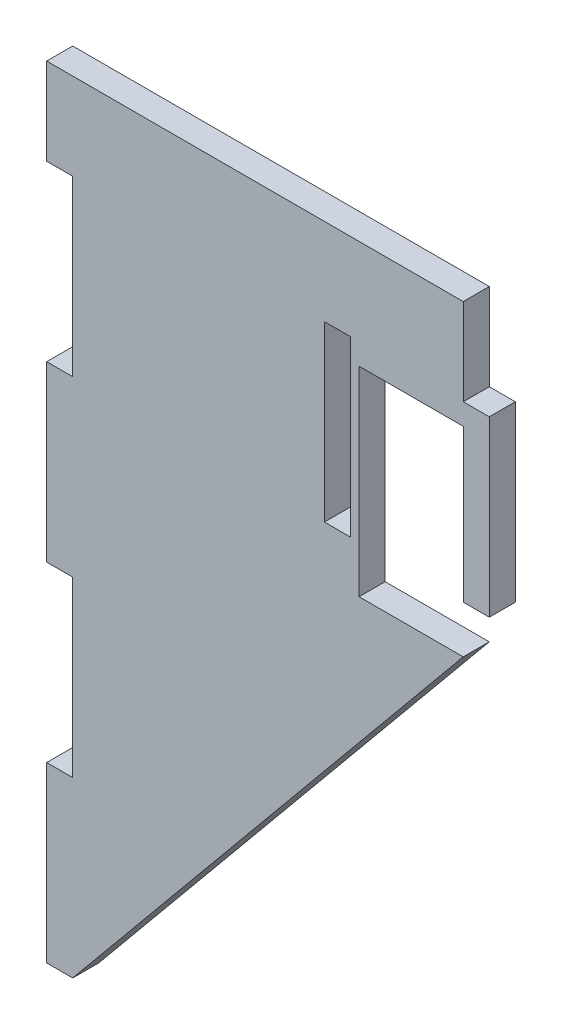
ISO-10303-21;
HEADER;
FILE_DESCRIPTION(('STEP AP214'),'2;1');
FILE_NAME('part.step','',(''),(''),'','','');
FILE_SCHEMA(('AUTOMOTIVE_DESIGN { 1 0 10303 214 1 1 1 1 }'));
ENDSEC;
DATA;
#1=APPLICATION_CONTEXT('core data for automotive mechanical design processes');
#2=APPLICATION_PROTOCOL_DEFINITION('international standard','automotive_design',2000,#1);
#3=PRODUCT_CONTEXT('',#1,'mechanical');
#4=PRODUCT('Part','Part','',(#3));
#5=PRODUCT_RELATED_PRODUCT_CATEGORY('part','',(#4));
#6=PRODUCT_DEFINITION_FORMATION('','',#4);
#7=PRODUCT_DEFINITION_CONTEXT('part definition',#1,'design');
#8=PRODUCT_DEFINITION('design','',#6,#7);
#9=PRODUCT_DEFINITION_SHAPE('','',#8);
#10=(LENGTH_UNIT() NAMED_UNIT(*) SI_UNIT(.MILLI.,.METRE.));
#11=(NAMED_UNIT(*) PLANE_ANGLE_UNIT() SI_UNIT($,.RADIAN.));
#12=(NAMED_UNIT(*) SI_UNIT($,.STERADIAN.) SOLID_ANGLE_UNIT());
#13=UNCERTAINTY_MEASURE_WITH_UNIT(LENGTH_MEASURE(1.E-05),#10,'distance_accuracy_value','');
#14=(GEOMETRIC_REPRESENTATION_CONTEXT(3) GLOBAL_UNCERTAINTY_ASSIGNED_CONTEXT((#13)) GLOBAL_UNIT_ASSIGNED_CONTEXT((#10,
#11,#12)) REPRESENTATION_CONTEXT('',''));
#15=CARTESIAN_POINT('',(0.,0.,0.));
#16=DIRECTION('',(0.,0.,1.));
#17=DIRECTION('',(1.,0.,0.));
#18=AXIS2_PLACEMENT_3D('',#15,#16,#17);
#19=CARTESIAN_POINT('',(0.,0.,3.));
#20=DIRECTION('',(0.,0.,-1.));
#21=DIRECTION('',(-1.,0.,0.));
#22=AXIS2_PLACEMENT_3D('',#19,#20,#21);
#23=PLANE('',#22);
#24=DIRECTION('',(1.,0.,0.));
#25=VECTOR('',#24,1.);
#26=CARTESIAN_POINT('',(-3.00000000000001,40.,3.));
#27=LINE('',#26,#25);
#28=CARTESIAN_POINT('',(-3.00000000000001,40.,3.));
#29=VERTEX_POINT('',#28);
#30=CARTESIAN_POINT('',(0.,40.,3.));
#31=VERTEX_POINT('',#30);
#32=EDGE_CURVE('E232',#29,#31,#27,.T.);
#33=ORIENTED_EDGE('',*,*,#32,.T.);
#34=DIRECTION('',(0.,-1.,0.));
#35=VECTOR('',#34,1.);
#36=CARTESIAN_POINT('',(0.,40.,3.));
#37=LINE('',#36,#35);
#38=CARTESIAN_POINT('',(0.,20.,3.));
#39=VERTEX_POINT('',#38);
#40=EDGE_CURVE('E235',#31,#39,#37,.T.);
#41=ORIENTED_EDGE('',*,*,#40,.T.);
#42=DIRECTION('',(-1.,0.,0.));
#43=VECTOR('',#42,1.);
#44=CARTESIAN_POINT('',(0.,20.,3.));
#45=LINE('',#44,#43);
#46=CARTESIAN_POINT('',(-3.,20.,3.));
#47=VERTEX_POINT('',#46);
#48=EDGE_CURVE('E238',#39,#47,#45,.T.);
#49=ORIENTED_EDGE('',*,*,#48,.T.);
#50=DIRECTION('',(0.,-1.,0.));
#51=VECTOR('',#50,1.);
#52=CARTESIAN_POINT('',(-3.,20.,3.));
#53=LINE('',#52,#51);
#54=CARTESIAN_POINT('',(-3.,0.,3.));
#55=VERTEX_POINT('',#54);
#56=EDGE_CURVE('E240',#47,#55,#53,.T.);
#57=ORIENTED_EDGE('',*,*,#56,.T.);
#58=DIRECTION('',(1.,0.,0.));
#59=VECTOR('',#58,1.);
#60=CARTESIAN_POINT('',(-3.,0.,3.));
#61=LINE('',#60,#59);
#62=CARTESIAN_POINT('',(0.,0.,3.));
#63=VERTEX_POINT('',#62);
#64=EDGE_CURVE('E242',#55,#63,#61,.T.);
#65=ORIENTED_EDGE('',*,*,#64,.T.);
#66=DIRECTION('',(0.636382954795564,0.771373278540077,0.));
#67=VECTOR('',#66,1.);
#68=CARTESIAN_POINT('',(0.,0.,3.));
#69=LINE('',#68,#67);
#70=CARTESIAN_POINT('',(45.,54.5454545454545,3.));
#71=VERTEX_POINT('',#70);
#72=EDGE_CURVE('E244',#63,#71,#69,.T.);
#73=ORIENTED_EDGE('',*,*,#72,.T.);
#74=DIRECTION('',(-1.,0.,0.));
#75=VECTOR('',#74,1.);
#76=CARTESIAN_POINT('',(45.,54.5454545454545,3.));
#77=LINE('',#76,#75);
#78=CARTESIAN_POINT('',(33.,54.5454545454545,3.));
#79=VERTEX_POINT('',#78);
#80=EDGE_CURVE('E246',#71,#79,#77,.T.);
#81=ORIENTED_EDGE('',*,*,#80,.T.);
#82=DIRECTION('',(0.,1.,0.));
#83=VECTOR('',#82,1.);
#84=CARTESIAN_POINT('',(33.,54.5454545454545,3.));
#85=LINE('',#84,#83);
#86=CARTESIAN_POINT('',(33.,77.5454545454545,3.));
#87=VERTEX_POINT('',#86);
#88=EDGE_CURVE('E248',#79,#87,#85,.T.);
#89=ORIENTED_EDGE('',*,*,#88,.T.);
#90=DIRECTION('',(1.,0.,0.));
#91=VECTOR('',#90,1.);
#92=CARTESIAN_POINT('',(33.,77.5454545454545,3.));
#93=LINE('',#92,#91);
#94=CARTESIAN_POINT('',(45.,77.5454545454545,3.));
#95=VERTEX_POINT('',#94);
#96=EDGE_CURVE('E250',#87,#95,#93,.T.);
#97=ORIENTED_EDGE('',*,*,#96,.T.);
#98=DIRECTION('',(0.,-1.,0.));
#99=VECTOR('',#98,1.);
#100=CARTESIAN_POINT('',(45.,77.5454545454545,3.));
#101=LINE('',#100,#99);
#102=CARTESIAN_POINT('',(45.,60.,3.));
#103=VERTEX_POINT('',#102);
#104=EDGE_CURVE('E252',#95,#103,#101,.T.);
#105=ORIENTED_EDGE('',*,*,#104,.T.);
#106=DIRECTION('',(1.,0.,0.));
#107=VECTOR('',#106,1.);
#108=CARTESIAN_POINT('',(48.,60.,3.));
#109=LINE('',#108,#107);
#110=CARTESIAN_POINT('',(48.,60.,3.));
#111=VERTEX_POINT('',#110);
#112=EDGE_CURVE('E254',#103,#111,#109,.T.);
#113=ORIENTED_EDGE('',*,*,#112,.T.);
#114=DIRECTION('',(0.,1.,0.));
#115=VECTOR('',#114,1.);
#116=CARTESIAN_POINT('',(48.,80.,3.));
#117=LINE('',#116,#115);
#118=CARTESIAN_POINT('',(48.,80.,3.));
#119=VERTEX_POINT('',#118);
#120=EDGE_CURVE('E256',#111,#119,#117,.T.);
#121=ORIENTED_EDGE('',*,*,#120,.T.);
#122=DIRECTION('',(-1.,0.,0.));
#123=VECTOR('',#122,1.);
#124=CARTESIAN_POINT('',(45.,80.,3.));
#125=LINE('',#124,#123);
#126=CARTESIAN_POINT('',(45.,80.,3.));
#127=VERTEX_POINT('',#126);
#128=EDGE_CURVE('E258',#119,#127,#125,.T.);
#129=ORIENTED_EDGE('',*,*,#128,.T.);
#130=DIRECTION('',(0.,1.,0.));
#131=VECTOR('',#130,1.);
#132=CARTESIAN_POINT('',(45.,90.,3.));
#133=LINE('',#132,#131);
#134=CARTESIAN_POINT('',(45.,90.,3.));
#135=VERTEX_POINT('',#134);
#136=EDGE_CURVE('E260',#127,#135,#133,.T.);
#137=ORIENTED_EDGE('',*,*,#136,.T.);
#138=DIRECTION('',(-1.,0.,0.));
#139=VECTOR('',#138,1.);
#140=CARTESIAN_POINT('',(15.,90.,3.));
#141=LINE('',#140,#139);
#142=CARTESIAN_POINT('',(-3.00000000000001,90.,3.));
#143=VERTEX_POINT('',#142);
#144=EDGE_CURVE('E262',#135,#143,#141,.T.);
#145=ORIENTED_EDGE('',*,*,#144,.T.);
#146=DIRECTION('',(0.,-1.,0.));
#147=VECTOR('',#146,1.);
#148=CARTESIAN_POINT('',(-3.,80.,3.));
#149=LINE('',#148,#147);
#150=CARTESIAN_POINT('',(-3.,80.,3.));
#151=VERTEX_POINT('',#150);
#152=EDGE_CURVE('E264',#143,#151,#149,.T.);
#153=ORIENTED_EDGE('',*,*,#152,.T.);
#154=DIRECTION('',(1.,0.,0.));
#155=VECTOR('',#154,1.);
#156=CARTESIAN_POINT('',(0.,80.,3.));
#157=LINE('',#156,#155);
#158=CARTESIAN_POINT('',(0.,80.,3.));
#159=VERTEX_POINT('',#158);
#160=EDGE_CURVE('E266',#151,#159,#157,.T.);
#161=ORIENTED_EDGE('',*,*,#160,.T.);
#162=DIRECTION('',(0.,-1.,0.));
#163=VECTOR('',#162,1.);
#164=CARTESIAN_POINT('',(0.,60.,3.));
#165=LINE('',#164,#163);
#166=CARTESIAN_POINT('',(0.,60.,3.));
#167=VERTEX_POINT('',#166);
#168=EDGE_CURVE('E268',#159,#167,#165,.T.);
#169=ORIENTED_EDGE('',*,*,#168,.T.);
#170=DIRECTION('',(-1.,0.,0.));
#171=VECTOR('',#170,1.);
#172=CARTESIAN_POINT('',(-3.00000000000001,60.,3.));
#173=LINE('',#172,#171);
#174=CARTESIAN_POINT('',(-3.00000000000001,60.,3.));
#175=VERTEX_POINT('',#174);
#176=EDGE_CURVE('E270',#167,#175,#173,.T.);
#177=ORIENTED_EDGE('',*,*,#176,.T.);
#178=DIRECTION('',(0.,-1.,0.));
#179=VECTOR('',#178,1.);
#180=CARTESIAN_POINT('',(-3.00000000000001,60.,3.));
#181=LINE('',#180,#179);
#182=EDGE_CURVE('E272',#175,#29,#181,.T.);
#183=ORIENTED_EDGE('',*,*,#182,.T.);
#184=EDGE_LOOP('',(#33,#41,#49,#57,#65,#73,#81,#89,#97,#105,#113,#121,#129,#137,#145,#153,#161,
#169,#177,#183));
#185=FACE_BOUND('',#184,.T.);
#186=DIRECTION('',(0.,1.,0.));
#187=VECTOR('',#186,1.);
#188=CARTESIAN_POINT('',(32.,60.,3.));
#189=LINE('',#188,#187);
#190=CARTESIAN_POINT('',(32.,60.,3.));
#191=VERTEX_POINT('',#190);
#192=CARTESIAN_POINT('',(32.,80.,3.));
#193=VERTEX_POINT('',#192);
#194=EDGE_CURVE('E196',#191,#193,#189,.T.);
#195=ORIENTED_EDGE('',*,*,#194,.F.);
#196=DIRECTION('',(1.,0.,0.));
#197=VECTOR('',#196,1.);
#198=CARTESIAN_POINT('',(32.,60.,3.));
#199=LINE('',#198,#197);
#200=CARTESIAN_POINT('',(29.,60.,3.));
#201=VERTEX_POINT('',#200);
#202=EDGE_CURVE('E218',#201,#191,#199,.T.);
#203=ORIENTED_EDGE('',*,*,#202,.F.);
#204=DIRECTION('',(0.,-1.,0.));
#205=VECTOR('',#204,1.);
#206=CARTESIAN_POINT('',(29.,60.,3.));
#207=LINE('',#206,#205);
#208=CARTESIAN_POINT('',(29.,80.,3.));
#209=VERTEX_POINT('',#208);
#210=EDGE_CURVE('E216',#209,#201,#207,.T.);
#211=ORIENTED_EDGE('',*,*,#210,.F.);
#212=DIRECTION('',(-1.,0.,0.));
#213=VECTOR('',#212,1.);
#214=CARTESIAN_POINT('',(29.,80.,3.));
#215=LINE('',#214,#213);
#216=EDGE_CURVE('E204',#193,#209,#215,.T.);
#217=ORIENTED_EDGE('',*,*,#216,.F.);
#218=EDGE_LOOP('',(#195,#203,#211,#217));
#219=FACE_BOUND('',#218,.T.);
#220=ADVANCED_FACE('F35',(#185,#219),#23,.F.);
#221=CARTESIAN_POINT('',(0.,0.,0.));
#222=DIRECTION('',(0.,0.,-1.));
#223=DIRECTION('',(-1.,0.,0.));
#224=AXIS2_PLACEMENT_3D('',#221,#222,#223);
#225=PLANE('',#224);
#226=DIRECTION('',(1.,0.,0.));
#227=VECTOR('',#226,1.);
#228=CARTESIAN_POINT('',(-3.00000000000001,40.,0.));
#229=LINE('',#228,#227);
#230=CARTESIAN_POINT('',(-3.00000000000001,40.,0.));
#231=VERTEX_POINT('',#230);
#232=CARTESIAN_POINT('',(0.,40.,0.));
#233=VERTEX_POINT('',#232);
#234=EDGE_CURVE('E212',#231,#233,#229,.T.);
#235=ORIENTED_EDGE('',*,*,#234,.F.);
#236=DIRECTION('',(0.,-1.,0.));
#237=VECTOR('',#236,1.);
#238=CARTESIAN_POINT('',(-3.00000000000001,60.,0.));
#239=LINE('',#238,#237);
#240=CARTESIAN_POINT('',(-3.00000000000001,60.,0.));
#241=VERTEX_POINT('',#240);
#242=EDGE_CURVE('E236',#241,#231,#239,.T.);
#243=ORIENTED_EDGE('',*,*,#242,.F.);
#244=DIRECTION('',(-1.,0.,0.));
#245=VECTOR('',#244,1.);
#246=CARTESIAN_POINT('',(-3.00000000000001,60.,0.));
#247=LINE('',#246,#245);
#248=CARTESIAN_POINT('',(0.,60.,0.));
#249=VERTEX_POINT('',#248);
#250=EDGE_CURVE('E312',#249,#241,#247,.T.);
#251=ORIENTED_EDGE('',*,*,#250,.F.);
#252=DIRECTION('',(0.,-1.,0.));
#253=VECTOR('',#252,1.);
#254=CARTESIAN_POINT('',(0.,60.,0.));
#255=LINE('',#254,#253);
#256=CARTESIAN_POINT('',(0.,80.,0.));
#257=VERTEX_POINT('',#256);
#258=EDGE_CURVE('E310',#257,#249,#255,.T.);
#259=ORIENTED_EDGE('',*,*,#258,.F.);
#260=DIRECTION('',(1.,0.,0.));
#261=VECTOR('',#260,1.);
#262=CARTESIAN_POINT('',(0.,80.,0.));
#263=LINE('',#262,#261);
#264=CARTESIAN_POINT('',(-3.,80.,0.));
#265=VERTEX_POINT('',#264);
#266=EDGE_CURVE('E308',#265,#257,#263,.T.);
#267=ORIENTED_EDGE('',*,*,#266,.F.);
#268=DIRECTION('',(0.,-1.,0.));
#269=VECTOR('',#268,1.);
#270=CARTESIAN_POINT('',(-3.,80.,0.));
#271=LINE('',#270,#269);
#272=CARTESIAN_POINT('',(-3.00000000000001,90.,0.));
#273=VERTEX_POINT('',#272);
#274=EDGE_CURVE('E306',#273,#265,#271,.T.);
#275=ORIENTED_EDGE('',*,*,#274,.F.);
#276=DIRECTION('',(-1.,0.,0.));
#277=VECTOR('',#276,1.);
#278=CARTESIAN_POINT('',(-3.00000000000001,90.,0.));
#279=LINE('',#278,#277);
#280=CARTESIAN_POINT('',(45.,90.,0.));
#281=VERTEX_POINT('',#280);
#282=EDGE_CURVE('E304',#281,#273,#279,.T.);
#283=ORIENTED_EDGE('',*,*,#282,.F.);
#284=DIRECTION('',(0.,1.,0.));
#285=VECTOR('',#284,1.);
#286=CARTESIAN_POINT('',(45.,90.,0.));
#287=LINE('',#286,#285);
#288=CARTESIAN_POINT('',(45.,80.,0.));
#289=VERTEX_POINT('',#288);
#290=EDGE_CURVE('E301',#289,#281,#287,.T.);
#291=ORIENTED_EDGE('',*,*,#290,.F.);
#292=DIRECTION('',(-1.,0.,0.));
#293=VECTOR('',#292,1.);
#294=CARTESIAN_POINT('',(45.,80.,0.));
#295=LINE('',#294,#293);
#296=CARTESIAN_POINT('',(48.,80.,0.));
#297=VERTEX_POINT('',#296);
#298=EDGE_CURVE('E299',#297,#289,#295,.T.);
#299=ORIENTED_EDGE('',*,*,#298,.F.);
#300=DIRECTION('',(0.,1.,0.));
#301=VECTOR('',#300,1.);
#302=CARTESIAN_POINT('',(48.,80.,0.));
#303=LINE('',#302,#301);
#304=CARTESIAN_POINT('',(48.,60.,0.));
#305=VERTEX_POINT('',#304);
#306=EDGE_CURVE('E297',#305,#297,#303,.T.);
#307=ORIENTED_EDGE('',*,*,#306,.F.);
#308=DIRECTION('',(1.,0.,0.));
#309=VECTOR('',#308,1.);
#310=CARTESIAN_POINT('',(48.,60.,0.));
#311=LINE('',#310,#309);
#312=CARTESIAN_POINT('',(45.,60.,0.));
#313=VERTEX_POINT('',#312);
#314=EDGE_CURVE('E295',#313,#305,#311,.T.);
#315=ORIENTED_EDGE('',*,*,#314,.F.);
#316=DIRECTION('',(0.,-1.,0.));
#317=VECTOR('',#316,1.);
#318=CARTESIAN_POINT('',(45.,77.5454545454545,0.));
#319=LINE('',#318,#317);
#320=CARTESIAN_POINT('',(45.,77.5454545454545,0.));
#321=VERTEX_POINT('',#320);
#322=EDGE_CURVE('E293',#321,#313,#319,.T.);
#323=ORIENTED_EDGE('',*,*,#322,.F.);
#324=DIRECTION('',(1.,0.,0.));
#325=VECTOR('',#324,1.);
#326=CARTESIAN_POINT('',(33.,77.5454545454545,0.));
#327=LINE('',#326,#325);
#328=CARTESIAN_POINT('',(33.,77.5454545454545,0.));
#329=VERTEX_POINT('',#328);
#330=EDGE_CURVE('E291',#329,#321,#327,.T.);
#331=ORIENTED_EDGE('',*,*,#330,.F.);
#332=DIRECTION('',(0.,1.,0.));
#333=VECTOR('',#332,1.);
#334=CARTESIAN_POINT('',(33.,54.5454545454545,0.));
#335=LINE('',#334,#333);
#336=CARTESIAN_POINT('',(33.,54.5454545454545,0.));
#337=VERTEX_POINT('',#336);
#338=EDGE_CURVE('E289',#337,#329,#335,.T.);
#339=ORIENTED_EDGE('',*,*,#338,.F.);
#340=DIRECTION('',(-1.,0.,0.));
#341=VECTOR('',#340,1.);
#342=CARTESIAN_POINT('',(45.,54.5454545454545,0.));
#343=LINE('',#342,#341);
#344=CARTESIAN_POINT('',(45.,54.5454545454545,0.));
#345=VERTEX_POINT('',#344);
#346=EDGE_CURVE('E287',#345,#337,#343,.T.);
#347=ORIENTED_EDGE('',*,*,#346,.F.);
#348=DIRECTION('',(0.636382954795564,0.771373278540077,0.));
#349=VECTOR('',#348,1.);
#350=CARTESIAN_POINT('',(0.,0.,0.));
#351=LINE('',#350,#349);
#352=CARTESIAN_POINT('',(0.,0.,0.));
#353=VERTEX_POINT('',#352);
#354=EDGE_CURVE('E285',#353,#345,#351,.T.);
#355=ORIENTED_EDGE('',*,*,#354,.F.);
#356=DIRECTION('',(1.,0.,0.));
#357=VECTOR('',#356,1.);
#358=CARTESIAN_POINT('',(-3.,0.,0.));
#359=LINE('',#358,#357);
#360=CARTESIAN_POINT('',(-3.,0.,0.));
#361=VERTEX_POINT('',#360);
#362=EDGE_CURVE('E283',#361,#353,#359,.T.);
#363=ORIENTED_EDGE('',*,*,#362,.F.);
#364=DIRECTION('',(0.,-1.,0.));
#365=VECTOR('',#364,1.);
#366=CARTESIAN_POINT('',(-3.,20.,0.));
#367=LINE('',#366,#365);
#368=CARTESIAN_POINT('',(-3.,20.,0.));
#369=VERTEX_POINT('',#368);
#370=EDGE_CURVE('E281',#369,#361,#367,.T.);
#371=ORIENTED_EDGE('',*,*,#370,.F.);
#372=DIRECTION('',(-1.,0.,0.));
#373=VECTOR('',#372,1.);
#374=CARTESIAN_POINT('',(0.,20.,0.));
#375=LINE('',#374,#373);
#376=CARTESIAN_POINT('',(0.,20.,0.));
#377=VERTEX_POINT('',#376);
#378=EDGE_CURVE('E279',#377,#369,#375,.T.);
#379=ORIENTED_EDGE('',*,*,#378,.F.);
#380=DIRECTION('',(0.,-1.,0.));
#381=VECTOR('',#380,1.);
#382=CARTESIAN_POINT('',(0.,40.,0.));
#383=LINE('',#382,#381);
#384=EDGE_CURVE('E277',#233,#377,#383,.T.);
#385=ORIENTED_EDGE('',*,*,#384,.F.);
#386=EDGE_LOOP('',(#235,#243,#251,#259,#267,#275,#283,#291,#299,#307,#315,#323,#331,#339,#347,
#355,#363,#371,#379,#385));
#387=FACE_BOUND('',#386,.T.);
#388=DIRECTION('',(1.,0.,0.));
#389=VECTOR('',#388,1.);
#390=CARTESIAN_POINT('',(32.,60.,0.));
#391=LINE('',#390,#389);
#392=CARTESIAN_POINT('',(29.,60.,0.));
#393=VERTEX_POINT('',#392);
#394=CARTESIAN_POINT('',(32.,60.,0.));
#395=VERTEX_POINT('',#394);
#396=EDGE_CURVE('E205',#393,#395,#391,.T.);
#397=ORIENTED_EDGE('',*,*,#396,.T.);
#398=DIRECTION('',(0.,1.,0.));
#399=VECTOR('',#398,1.);
#400=CARTESIAN_POINT('',(32.,60.,0.));
#401=LINE('',#400,#399);
#402=CARTESIAN_POINT('',(32.,80.,0.));
#403=VERTEX_POINT('',#402);
#404=EDGE_CURVE('E58',#395,#403,#401,.T.);
#405=ORIENTED_EDGE('',*,*,#404,.T.);
#406=DIRECTION('',(-1.,0.,0.));
#407=VECTOR('',#406,1.);
#408=CARTESIAN_POINT('',(29.,80.,0.));
#409=LINE('',#408,#407);
#410=CARTESIAN_POINT('',(29.,80.,0.));
#411=VERTEX_POINT('',#410);
#412=EDGE_CURVE('E211',#403,#411,#409,.T.);
#413=ORIENTED_EDGE('',*,*,#412,.T.);
#414=DIRECTION('',(0.,-1.,0.));
#415=VECTOR('',#414,1.);
#416=CARTESIAN_POINT('',(29.,60.,0.));
#417=LINE('',#416,#415);
#418=EDGE_CURVE('E224',#411,#393,#417,.T.);
#419=ORIENTED_EDGE('',*,*,#418,.T.);
#420=EDGE_LOOP('',(#397,#405,#413,#419));
#421=FACE_BOUND('',#420,.T.);
#422=ADVANCED_FACE('F378',(#387,#421),#225,.T.);
#423=CARTESIAN_POINT('',(-3.00000000000001,40.,3.));
#424=DIRECTION('',(0.,1.,0.));
#425=DIRECTION('',(0.,0.,1.));
#426=AXIS2_PLACEMENT_3D('',#423,#424,#425);
#427=PLANE('',#426);
#428=ORIENTED_EDGE('',*,*,#234,.T.);
#429=DIRECTION('',(0.,0.,-1.));
#430=VECTOR('',#429,1.);
#431=CARTESIAN_POINT('',(0.,40.,3.));
#432=LINE('',#431,#430);
#433=EDGE_CURVE('E11',#31,#233,#432,.T.);
#434=ORIENTED_EDGE('',*,*,#433,.F.);
#435=ORIENTED_EDGE('',*,*,#32,.F.);
#436=DIRECTION('',(0.,0.,-1.));
#437=VECTOR('',#436,1.);
#438=CARTESIAN_POINT('',(-3.00000000000001,40.,3.));
#439=LINE('',#438,#437);
#440=EDGE_CURVE('E274',#29,#231,#439,.T.);
#441=ORIENTED_EDGE('',*,*,#440,.T.);
#442=EDGE_LOOP('',(#428,#434,#435,#441));
#443=FACE_BOUND('',#442,.T.);
#444=ADVANCED_FACE('F37',(#443),#427,.F.);
#445=CARTESIAN_POINT('',(0.,40.,3.));
#446=DIRECTION('',(1.,0.,0.));
#447=DIRECTION('',(0.,0.,-1.));
#448=AXIS2_PLACEMENT_3D('',#445,#446,#447);
#449=PLANE('',#448);
#450=ORIENTED_EDGE('',*,*,#384,.T.);
#451=DIRECTION('',(0.,0.,-1.));
#452=VECTOR('',#451,1.);
#453=CARTESIAN_POINT('',(0.,20.,3.));
#454=LINE('',#453,#452);
#455=EDGE_CURVE('E43',#39,#377,#454,.T.);
#456=ORIENTED_EDGE('',*,*,#455,.F.);
#457=ORIENTED_EDGE('',*,*,#40,.F.);
#458=ORIENTED_EDGE('',*,*,#433,.T.);
#459=EDGE_LOOP('',(#450,#456,#457,#458));
#460=FACE_BOUND('',#459,.T.);
#461=ADVANCED_FACE('F395',(#460),#449,.F.);
#462=CARTESIAN_POINT('',(0.,20.,3.));
#463=DIRECTION('',(0.,-1.,0.));
#464=DIRECTION('',(1.,0.,0.));
#465=AXIS2_PLACEMENT_3D('',#462,#463,#464);
#466=PLANE('',#465);
#467=ORIENTED_EDGE('',*,*,#378,.T.);
#468=DIRECTION('',(0.,0.,-1.));
#469=VECTOR('',#468,1.);
#470=CARTESIAN_POINT('',(-3.,20.,3.));
#471=LINE('',#470,#469);
#472=EDGE_CURVE('E365',#47,#369,#471,.T.);
#473=ORIENTED_EDGE('',*,*,#472,.F.);
#474=ORIENTED_EDGE('',*,*,#48,.F.);
#475=ORIENTED_EDGE('',*,*,#455,.T.);
#476=EDGE_LOOP('',(#467,#473,#474,#475));
#477=FACE_BOUND('',#476,.T.);
#478=ADVANCED_FACE('F372',(#477),#466,.F.);
#479=CARTESIAN_POINT('',(-3.,20.,3.));
#480=DIRECTION('',(1.,0.,0.));
#481=DIRECTION('',(0.,1.,0.));
#482=AXIS2_PLACEMENT_3D('',#479,#480,#481);
#483=PLANE('',#482);
#484=ORIENTED_EDGE('',*,*,#370,.T.);
#485=DIRECTION('',(0.,0.,-1.));
#486=VECTOR('',#485,1.);
#487=CARTESIAN_POINT('',(-3.,0.,3.));
#488=LINE('',#487,#486);
#489=EDGE_CURVE('E362',#55,#361,#488,.T.);
#490=ORIENTED_EDGE('',*,*,#489,.F.);
#491=ORIENTED_EDGE('',*,*,#56,.F.);
#492=ORIENTED_EDGE('',*,*,#472,.T.);
#493=EDGE_LOOP('',(#484,#490,#491,#492));
#494=FACE_BOUND('',#493,.T.);
#495=ADVANCED_FACE('F384',(#494),#483,.F.);
#496=CARTESIAN_POINT('',(-3.,0.,3.));
#497=DIRECTION('',(0.,1.,0.));
#498=DIRECTION('',(0.,0.,1.));
#499=AXIS2_PLACEMENT_3D('',#496,#497,#498);
#500=PLANE('',#499);
#501=ORIENTED_EDGE('',*,*,#362,.T.);
#502=DIRECTION('',(0.,0.,-1.));
#503=VECTOR('',#502,1.);
#504=CARTESIAN_POINT('',(0.,0.,3.));
#505=LINE('',#504,#503);
#506=EDGE_CURVE('E359',#63,#353,#505,.T.);
#507=ORIENTED_EDGE('',*,*,#506,.F.);
#508=ORIENTED_EDGE('',*,*,#64,.F.);
#509=ORIENTED_EDGE('',*,*,#489,.T.);
#510=EDGE_LOOP('',(#501,#507,#508,#509));
#511=FACE_BOUND('',#510,.T.);
#512=ADVANCED_FACE('F388',(#511),#500,.F.);
#513=CARTESIAN_POINT('',(0.,0.,3.));
#514=DIRECTION('',(-0.771373278540077,0.636382954795564,0.));
#515=DIRECTION('',(-0.636382954795564,-0.771373278540077,0.));
#516=AXIS2_PLACEMENT_3D('',#513,#514,#515);
#517=PLANE('',#516);
#518=ORIENTED_EDGE('',*,*,#354,.T.);
#519=DIRECTION('',(0.,0.,-1.));
#520=VECTOR('',#519,1.);
#521=CARTESIAN_POINT('',(45.,54.5454545454545,3.));
#522=LINE('',#521,#520);
#523=EDGE_CURVE('E356',#71,#345,#522,.T.);
#524=ORIENTED_EDGE('',*,*,#523,.F.);
#525=ORIENTED_EDGE('',*,*,#72,.F.);
#526=ORIENTED_EDGE('',*,*,#506,.T.);
#527=EDGE_LOOP('',(#518,#524,#525,#526));
#528=FACE_BOUND('',#527,.T.);
#529=ADVANCED_FACE('F467',(#528),#517,.F.);
#530=CARTESIAN_POINT('',(45.,54.5454545454545,3.));
#531=DIRECTION('',(0.,-1.,0.));
#532=DIRECTION('',(0.,0.,-1.));
#533=AXIS2_PLACEMENT_3D('',#530,#531,#532);
#534=PLANE('',#533);
#535=ORIENTED_EDGE('',*,*,#346,.T.);
#536=DIRECTION('',(0.,0.,-1.));
#537=VECTOR('',#536,1.);
#538=CARTESIAN_POINT('',(33.,54.5454545454545,3.));
#539=LINE('',#538,#537);
#540=EDGE_CURVE('E353',#79,#337,#539,.T.);
#541=ORIENTED_EDGE('',*,*,#540,.F.);
#542=ORIENTED_EDGE('',*,*,#80,.F.);
#543=ORIENTED_EDGE('',*,*,#523,.T.);
#544=EDGE_LOOP('',(#535,#541,#542,#543));
#545=FACE_BOUND('',#544,.T.);
#546=ADVANCED_FACE('F465',(#545),#534,.F.);
#547=CARTESIAN_POINT('',(33.,54.5454545454545,3.));
#548=DIRECTION('',(-1.,0.,0.));
#549=DIRECTION('',(0.,0.,1.));
#550=AXIS2_PLACEMENT_3D('',#547,#548,#549);
#551=PLANE('',#550);
#552=ORIENTED_EDGE('',*,*,#338,.T.);
#553=DIRECTION('',(0.,0.,-1.));
#554=VECTOR('',#553,1.);
#555=CARTESIAN_POINT('',(33.,77.5454545454545,3.));
#556=LINE('',#555,#554);
#557=EDGE_CURVE('E350',#87,#329,#556,.T.);
#558=ORIENTED_EDGE('',*,*,#557,.F.);
#559=ORIENTED_EDGE('',*,*,#88,.F.);
#560=ORIENTED_EDGE('',*,*,#540,.T.);
#561=EDGE_LOOP('',(#552,#558,#559,#560));
#562=FACE_BOUND('',#561,.T.);
#563=ADVANCED_FACE('F461',(#562),#551,.F.);
#564=CARTESIAN_POINT('',(33.,77.5454545454545,3.));
#565=DIRECTION('',(0.,1.,0.));
#566=DIRECTION('',(0.,0.,1.));
#567=AXIS2_PLACEMENT_3D('',#564,#565,#566);
#568=PLANE('',#567);
#569=ORIENTED_EDGE('',*,*,#330,.T.);
#570=DIRECTION('',(0.,0.,-1.));
#571=VECTOR('',#570,1.);
#572=CARTESIAN_POINT('',(45.,77.5454545454545,3.));
#573=LINE('',#572,#571);
#574=EDGE_CURVE('E347',#95,#321,#573,.T.);
#575=ORIENTED_EDGE('',*,*,#574,.F.);
#576=ORIENTED_EDGE('',*,*,#96,.F.);
#577=ORIENTED_EDGE('',*,*,#557,.T.);
#578=EDGE_LOOP('',(#569,#575,#576,#577));
#579=FACE_BOUND('',#578,.T.);
#580=ADVANCED_FACE('F456',(#579),#568,.F.);
#581=CARTESIAN_POINT('',(45.,77.5454545454545,3.));
#582=DIRECTION('',(1.,0.,0.));
#583=DIRECTION('',(0.,1.,0.));
#584=AXIS2_PLACEMENT_3D('',#581,#582,#583);
#585=PLANE('',#584);
#586=ORIENTED_EDGE('',*,*,#322,.T.);
#587=DIRECTION('',(0.,0.,-1.));
#588=VECTOR('',#587,1.);
#589=CARTESIAN_POINT('',(45.,60.,3.));
#590=LINE('',#589,#588);
#591=EDGE_CURVE('E344',#103,#313,#590,.T.);
#592=ORIENTED_EDGE('',*,*,#591,.F.);
#593=ORIENTED_EDGE('',*,*,#104,.F.);
#594=ORIENTED_EDGE('',*,*,#574,.T.);
#595=EDGE_LOOP('',(#586,#592,#593,#594));
#596=FACE_BOUND('',#595,.T.);
#597=ADVANCED_FACE('F450',(#596),#585,.F.);
#598=CARTESIAN_POINT('',(48.,60.,3.));
#599=DIRECTION('',(0.,1.,0.));
#600=DIRECTION('',(0.,0.,1.));
#601=AXIS2_PLACEMENT_3D('',#598,#599,#600);
#602=PLANE('',#601);
#603=ORIENTED_EDGE('',*,*,#314,.T.);
#604=DIRECTION('',(0.,0.,-1.));
#605=VECTOR('',#604,1.);
#606=CARTESIAN_POINT('',(48.,60.,3.));
#607=LINE('',#606,#605);
#608=EDGE_CURVE('E341',#111,#305,#607,.T.);
#609=ORIENTED_EDGE('',*,*,#608,.F.);
#610=ORIENTED_EDGE('',*,*,#112,.F.);
#611=ORIENTED_EDGE('',*,*,#591,.T.);
#612=EDGE_LOOP('',(#603,#609,#610,#611));
#613=FACE_BOUND('',#612,.T.);
#614=ADVANCED_FACE('F446',(#613),#602,.F.);
#615=CARTESIAN_POINT('',(48.,80.,3.));
#616=DIRECTION('',(-1.,0.,0.));
#617=DIRECTION('',(0.,0.,1.));
#618=AXIS2_PLACEMENT_3D('',#615,#616,#617);
#619=PLANE('',#618);
#620=ORIENTED_EDGE('',*,*,#306,.T.);
#621=DIRECTION('',(0.,0.,-1.));
#622=VECTOR('',#621,1.);
#623=CARTESIAN_POINT('',(48.,80.,3.));
#624=LINE('',#623,#622);
#625=EDGE_CURVE('E338',#119,#297,#624,.T.);
#626=ORIENTED_EDGE('',*,*,#625,.F.);
#627=ORIENTED_EDGE('',*,*,#120,.F.);
#628=ORIENTED_EDGE('',*,*,#608,.T.);
#629=EDGE_LOOP('',(#620,#626,#627,#628));
#630=FACE_BOUND('',#629,.T.);
#631=ADVANCED_FACE('F441',(#630),#619,.F.);
#632=CARTESIAN_POINT('',(45.,80.,3.));
#633=DIRECTION('',(0.,-1.,0.));
#634=DIRECTION('',(0.,0.,-1.));
#635=AXIS2_PLACEMENT_3D('',#632,#633,#634);
#636=PLANE('',#635);
#637=ORIENTED_EDGE('',*,*,#298,.T.);
#638=DIRECTION('',(0.,0.,-1.));
#639=VECTOR('',#638,1.);
#640=CARTESIAN_POINT('',(45.,80.,3.));
#641=LINE('',#640,#639);
#642=EDGE_CURVE('E335',#127,#289,#641,.T.);
#643=ORIENTED_EDGE('',*,*,#642,.F.);
#644=ORIENTED_EDGE('',*,*,#128,.F.);
#645=ORIENTED_EDGE('',*,*,#625,.T.);
#646=EDGE_LOOP('',(#637,#643,#644,#645));
#647=FACE_BOUND('',#646,.T.);
#648=ADVANCED_FACE('F435',(#647),#636,.F.);
#649=CARTESIAN_POINT('',(45.,90.,3.));
#650=DIRECTION('',(-1.,0.,0.));
#651=DIRECTION('',(0.,0.,1.));
#652=AXIS2_PLACEMENT_3D('',#649,#650,#651);
#653=PLANE('',#652);
#654=ORIENTED_EDGE('',*,*,#290,.T.);
#655=DIRECTION('',(0.,0.,-1.));
#656=VECTOR('',#655,1.);
#657=CARTESIAN_POINT('',(45.,90.,3.));
#658=LINE('',#657,#656);
#659=EDGE_CURVE('E332',#135,#281,#658,.T.);
#660=ORIENTED_EDGE('',*,*,#659,.F.);
#661=ORIENTED_EDGE('',*,*,#136,.F.);
#662=ORIENTED_EDGE('',*,*,#642,.T.);
#663=EDGE_LOOP('',(#654,#660,#661,#662));
#664=FACE_BOUND('',#663,.T.);
#665=ADVANCED_FACE('F430',(#664),#653,.F.);
#666=CARTESIAN_POINT('',(-3.00000000000001,90.,3.));
#667=DIRECTION('',(0.,-1.,0.));
#668=DIRECTION('',(0.,0.,-1.));
#669=AXIS2_PLACEMENT_3D('',#666,#667,#668);
#670=PLANE('',#669);
#671=ORIENTED_EDGE('',*,*,#282,.T.);
#672=DIRECTION('',(0.,0.,-1.));
#673=VECTOR('',#672,1.);
#674=CARTESIAN_POINT('',(-3.00000000000001,90.,3.));
#675=LINE('',#674,#673);
#676=EDGE_CURVE('E329',#143,#273,#675,.T.);
#677=ORIENTED_EDGE('',*,*,#676,.F.);
#678=ORIENTED_EDGE('',*,*,#144,.F.);
#679=ORIENTED_EDGE('',*,*,#659,.T.);
#680=EDGE_LOOP('',(#671,#677,#678,#679));
#681=FACE_BOUND('',#680,.T.);
#682=ADVANCED_FACE('F425',(#681),#670,.F.);
#683=CARTESIAN_POINT('',(-3.,80.,3.));
#684=DIRECTION('',(1.,0.,0.));
#685=DIRECTION('',(0.,1.,0.));
#686=AXIS2_PLACEMENT_3D('',#683,#684,#685);
#687=PLANE('',#686);
#688=ORIENTED_EDGE('',*,*,#274,.T.);
#689=DIRECTION('',(0.,0.,-1.));
#690=VECTOR('',#689,1.);
#691=CARTESIAN_POINT('',(-3.,80.,3.));
#692=LINE('',#691,#690);
#693=EDGE_CURVE('E326',#151,#265,#692,.T.);
#694=ORIENTED_EDGE('',*,*,#693,.F.);
#695=ORIENTED_EDGE('',*,*,#152,.F.);
#696=ORIENTED_EDGE('',*,*,#676,.T.);
#697=EDGE_LOOP('',(#688,#694,#695,#696));
#698=FACE_BOUND('',#697,.T.);
#699=ADVANCED_FACE('F421',(#698),#687,.F.);
#700=CARTESIAN_POINT('',(0.,80.,3.));
#701=DIRECTION('',(0.,1.,0.));
#702=DIRECTION('',(0.,0.,1.));
#703=AXIS2_PLACEMENT_3D('',#700,#701,#702);
#704=PLANE('',#703);
#705=ORIENTED_EDGE('',*,*,#266,.T.);
#706=DIRECTION('',(0.,0.,-1.));
#707=VECTOR('',#706,1.);
#708=CARTESIAN_POINT('',(0.,80.,3.));
#709=LINE('',#708,#707);
#710=EDGE_CURVE('E323',#159,#257,#709,.T.);
#711=ORIENTED_EDGE('',*,*,#710,.F.);
#712=ORIENTED_EDGE('',*,*,#160,.F.);
#713=ORIENTED_EDGE('',*,*,#693,.T.);
#714=EDGE_LOOP('',(#705,#711,#712,#713));
#715=FACE_BOUND('',#714,.T.);
#716=ADVANCED_FACE('F416',(#715),#704,.F.);
#717=CARTESIAN_POINT('',(0.,60.,3.));
#718=DIRECTION('',(1.,0.,0.));
#719=DIRECTION('',(0.,0.,-1.));
#720=AXIS2_PLACEMENT_3D('',#717,#718,#719);
#721=PLANE('',#720);
#722=ORIENTED_EDGE('',*,*,#258,.T.);
#723=DIRECTION('',(0.,0.,-1.));
#724=VECTOR('',#723,1.);
#725=CARTESIAN_POINT('',(0.,60.,3.));
#726=LINE('',#725,#724);
#727=EDGE_CURVE('E320',#167,#249,#726,.T.);
#728=ORIENTED_EDGE('',*,*,#727,.F.);
#729=ORIENTED_EDGE('',*,*,#168,.F.);
#730=ORIENTED_EDGE('',*,*,#710,.T.);
#731=EDGE_LOOP('',(#722,#728,#729,#730));
#732=FACE_BOUND('',#731,.T.);
#733=ADVANCED_FACE('F411',(#732),#721,.F.);
#734=CARTESIAN_POINT('',(-3.00000000000001,60.,3.));
#735=DIRECTION('',(0.,-1.,0.));
#736=DIRECTION('',(0.,0.,-1.));
#737=AXIS2_PLACEMENT_3D('',#734,#735,#736);
#738=PLANE('',#737);
#739=ORIENTED_EDGE('',*,*,#250,.T.);
#740=DIRECTION('',(0.,0.,-1.));
#741=VECTOR('',#740,1.);
#742=CARTESIAN_POINT('',(-3.00000000000001,60.,3.));
#743=LINE('',#742,#741);
#744=EDGE_CURVE('E317',#175,#241,#743,.T.);
#745=ORIENTED_EDGE('',*,*,#744,.F.);
#746=ORIENTED_EDGE('',*,*,#176,.F.);
#747=ORIENTED_EDGE('',*,*,#727,.T.);
#748=EDGE_LOOP('',(#739,#745,#746,#747));
#749=FACE_BOUND('',#748,.T.);
#750=ADVANCED_FACE('F407',(#749),#738,.F.);
#751=CARTESIAN_POINT('',(-3.00000000000001,60.,3.));
#752=DIRECTION('',(1.,0.,0.));
#753=DIRECTION('',(0.,0.,-1.));
#754=AXIS2_PLACEMENT_3D('',#751,#752,#753);
#755=PLANE('',#754);
#756=ORIENTED_EDGE('',*,*,#242,.T.);
#757=ORIENTED_EDGE('',*,*,#440,.F.);
#758=ORIENTED_EDGE('',*,*,#182,.F.);
#759=ORIENTED_EDGE('',*,*,#744,.T.);
#760=EDGE_LOOP('',(#756,#757,#758,#759));
#761=FACE_BOUND('',#760,.T.);
#762=ADVANCED_FACE('F402',(#761),#755,.F.);
#763=CARTESIAN_POINT('',(32.,60.,3.));
#764=DIRECTION('',(-1.,0.,0.));
#765=DIRECTION('',(0.,-1.,0.));
#766=AXIS2_PLACEMENT_3D('',#763,#764,#765);
#767=PLANE('',#766);
#768=ORIENTED_EDGE('',*,*,#404,.F.);
#769=DIRECTION('',(0.,0.,-1.));
#770=VECTOR('',#769,1.);
#771=CARTESIAN_POINT('',(32.,60.,3.));
#772=LINE('',#771,#770);
#773=EDGE_CURVE('E200',#191,#395,#772,.T.);
#774=ORIENTED_EDGE('',*,*,#773,.F.);
#775=ORIENTED_EDGE('',*,*,#194,.T.);
#776=DIRECTION('',(0.,0.,-1.));
#777=VECTOR('',#776,1.);
#778=CARTESIAN_POINT('',(32.,80.,3.));
#779=LINE('',#778,#777);
#780=EDGE_CURVE('E199',#193,#403,#779,.T.);
#781=ORIENTED_EDGE('',*,*,#780,.T.);
#782=EDGE_LOOP('',(#768,#774,#775,#781));
#783=FACE_BOUND('',#782,.T.);
#784=ADVANCED_FACE('F198',(#783),#767,.T.);
#785=CARTESIAN_POINT('',(29.,80.,3.));
#786=DIRECTION('',(0.,-1.,0.));
#787=DIRECTION('',(0.,0.,-1.));
#788=AXIS2_PLACEMENT_3D('',#785,#786,#787);
#789=PLANE('',#788);
#790=ORIENTED_EDGE('',*,*,#412,.F.);
#791=ORIENTED_EDGE('',*,*,#780,.F.);
#792=ORIENTED_EDGE('',*,*,#216,.T.);
#793=DIRECTION('',(0.,0.,-1.));
#794=VECTOR('',#793,1.);
#795=CARTESIAN_POINT('',(29.,80.,3.));
#796=LINE('',#795,#794);
#797=EDGE_CURVE('E213',#209,#411,#796,.T.);
#798=ORIENTED_EDGE('',*,*,#797,.T.);
#799=EDGE_LOOP('',(#790,#791,#792,#798));
#800=FACE_BOUND('',#799,.T.);
#801=ADVANCED_FACE('F208',(#800),#789,.T.);
#802=CARTESIAN_POINT('',(29.,60.,3.));
#803=DIRECTION('',(1.,0.,0.));
#804=DIRECTION('',(0.,1.,0.));
#805=AXIS2_PLACEMENT_3D('',#802,#803,#804);
#806=PLANE('',#805);
#807=ORIENTED_EDGE('',*,*,#418,.F.);
#808=ORIENTED_EDGE('',*,*,#797,.F.);
#809=ORIENTED_EDGE('',*,*,#210,.T.);
#810=DIRECTION('',(0.,0.,-1.));
#811=VECTOR('',#810,1.);
#812=CARTESIAN_POINT('',(29.,60.,3.));
#813=LINE('',#812,#811);
#814=EDGE_CURVE('E50',#201,#393,#813,.T.);
#815=ORIENTED_EDGE('',*,*,#814,.T.);
#816=EDGE_LOOP('',(#807,#808,#809,#815));
#817=FACE_BOUND('',#816,.T.);
#818=ADVANCED_FACE('F573',(#817),#806,.T.);
#819=CARTESIAN_POINT('',(32.,60.,3.));
#820=DIRECTION('',(0.,1.,0.));
#821=DIRECTION('',(0.,0.,1.));
#822=AXIS2_PLACEMENT_3D('',#819,#820,#821);
#823=PLANE('',#822);
#824=ORIENTED_EDGE('',*,*,#396,.F.);
#825=ORIENTED_EDGE('',*,*,#814,.F.);
#826=ORIENTED_EDGE('',*,*,#202,.T.);
#827=ORIENTED_EDGE('',*,*,#773,.T.);
#828=EDGE_LOOP('',(#824,#825,#826,#827));
#829=FACE_BOUND('',#828,.T.);
#830=ADVANCED_FACE('F579',(#829),#823,.T.);
#831=CLOSED_SHELL('',(#220,#422,#444,#461,#478,#495,#512,#529,#546,#563,#580,#597,#614,#631,
#648,#665,#682,#699,#716,#733,#750,#762,#784,#801,#818,#830));
#832=MANIFOLD_SOLID_BREP('B2',#831);
#833=ADVANCED_BREP_SHAPE_REPRESENTATION('',(#18,#832),#14);
#834=SHAPE_DEFINITION_REPRESENTATION(#9,#833);
ENDSEC;
END-ISO-10303-21;
